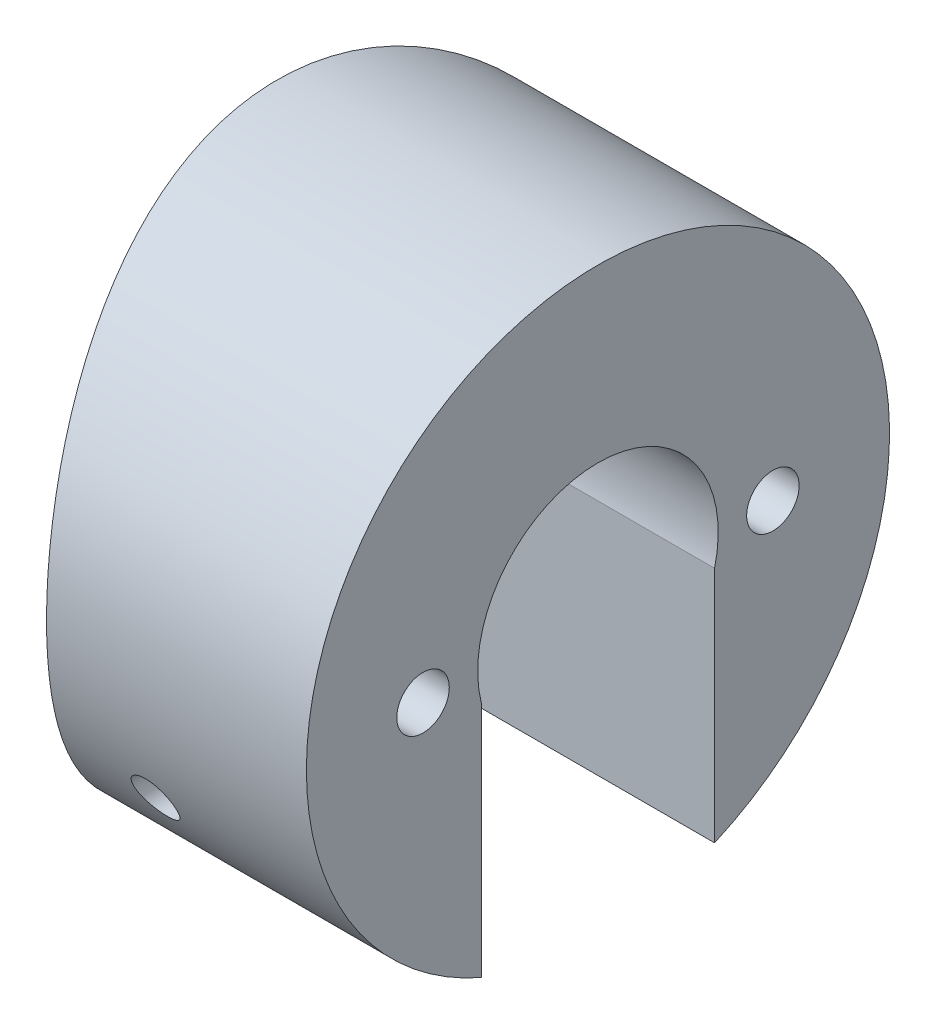
ISO-10303-21;
HEADER;
FILE_DESCRIPTION(('STEP AP214'),'2;1');
FILE_NAME('part.step','',(''),(''),'','','');
FILE_SCHEMA(('AUTOMOTIVE_DESIGN { 1 0 10303 214 1 1 1 1 }'));
ENDSEC;
DATA;
#1=APPLICATION_CONTEXT('core data for automotive mechanical design processes');
#2=APPLICATION_PROTOCOL_DEFINITION('international standard','automotive_design',2000,#1);
#3=PRODUCT_CONTEXT('',#1,'mechanical');
#4=PRODUCT('Part','Part','',(#3));
#5=PRODUCT_RELATED_PRODUCT_CATEGORY('part','',(#4));
#6=PRODUCT_DEFINITION_FORMATION('','',#4);
#7=PRODUCT_DEFINITION_CONTEXT('part definition',#1,'design');
#8=PRODUCT_DEFINITION('design','',#6,#7);
#9=PRODUCT_DEFINITION_SHAPE('','',#8);
#10=(LENGTH_UNIT() NAMED_UNIT(*) SI_UNIT(.MILLI.,.METRE.));
#11=(NAMED_UNIT(*) PLANE_ANGLE_UNIT() SI_UNIT($,.RADIAN.));
#12=(NAMED_UNIT(*) SI_UNIT($,.STERADIAN.) SOLID_ANGLE_UNIT());
#13=UNCERTAINTY_MEASURE_WITH_UNIT(LENGTH_MEASURE(1.E-05),#10,'distance_accuracy_value','');
#14=(GEOMETRIC_REPRESENTATION_CONTEXT(3) GLOBAL_UNCERTAINTY_ASSIGNED_CONTEXT((#13)) GLOBAL_UNIT_ASSIGNED_CONTEXT((#10,
#11,#12)) REPRESENTATION_CONTEXT('',''));
#15=CARTESIAN_POINT('',(0.,0.,0.));
#16=DIRECTION('',(0.,0.,1.));
#17=DIRECTION('',(1.,0.,0.));
#18=AXIS2_PLACEMENT_3D('',#15,#16,#17);
#19=CARTESIAN_POINT('',(22.,0.,0.));
#20=DIRECTION('',(-1.,0.,0.));
#21=DIRECTION('',(0.,0.,1.));
#22=AXIS2_PLACEMENT_3D('',#19,#20,#21);
#23=CYLINDRICAL_SURFACE('',#22,20.);
#24=CARTESIAN_POINT('',(22.,0.,0.));
#25=DIRECTION('',(1.,0.,0.));
#26=DIRECTION('',(0.,0.,-1.));
#27=AXIS2_PLACEMENT_3D('',#24,#25,#26);
#28=CIRCLE('',#27,20.);
#29=CARTESIAN_POINT('',(22.,-18.3303027798234,-8.));
#30=VERTEX_POINT('',#29);
#31=CARTESIAN_POINT('',(22.,-18.3303027798234,8.));
#32=VERTEX_POINT('',#31);
#33=EDGE_CURVE('E11',#30,#32,#28,.T.);
#34=ORIENTED_EDGE('',*,*,#33,.F.);
#35=DIRECTION('',(1.,0.,0.));
#36=VECTOR('',#35,1.);
#37=CARTESIAN_POINT('',(3.,-18.3303027798234,-8.));
#38=LINE('',#37,#36);
#39=CARTESIAN_POINT('',(3.,-18.3303027798234,-8.));
#40=VERTEX_POINT('',#39);
#41=EDGE_CURVE('E134',#40,#30,#38,.T.);
#42=ORIENTED_EDGE('',*,*,#41,.F.);
#43=CARTESIAN_POINT('',(3.,0.,0.));
#44=DIRECTION('',(1.,0.,0.));
#45=DIRECTION('',(0.,0.,-1.));
#46=AXIS2_PLACEMENT_3D('',#43,#44,#45);
#47=CIRCLE('',#46,20.);
#48=CARTESIAN_POINT('',(3.,-18.3303027798234,8.));
#49=VERTEX_POINT('',#48);
#50=EDGE_CURVE('E122',#49,#40,#47,.T.);
#51=ORIENTED_EDGE('',*,*,#50,.F.);
#52=DIRECTION('',(1.,0.,0.));
#53=VECTOR('',#52,1.);
#54=CARTESIAN_POINT('',(3.,-18.3303027798234,8.));
#55=LINE('',#54,#53);
#56=EDGE_CURVE('E136',#49,#32,#55,.T.);
#57=ORIENTED_EDGE('',*,*,#56,.T.);
#58=EDGE_LOOP('',(#34,#42,#51,#57));
#59=FACE_BOUND('',#58,.T.);
#60=CARTESIAN_POINT('',(4.1742430504416,0.,20.));
#61=CARTESIAN_POINT('',(4.17424574491991,0.536358870073699,20.000002745086));
#62=CARTESIAN_POINT('',(4.16480074871791,1.0726807787122,19.9784057100183));
#63=CARTESIAN_POINT('',(4.12734628815721,2.1413968490551,19.8922564992821));
#64=CARTESIAN_POINT('',(4.09933075895137,2.67378967012695,19.8276902905225));
#65=CARTESIAN_POINT('',(4.02562578666756,3.7311779674192,19.6561847747043));
#66=CARTESIAN_POINT('',(3.97991268626716,4.25616256290606,19.5491887446828));
#67=CARTESIAN_POINT('',(3.87232318583603,5.29425280812158,19.2939517854075));
#68=CARTESIAN_POINT('',(3.81044792736054,5.80735929403196,19.1457137690833));
#69=CARTESIAN_POINT('',(3.67271524489487,6.81662973753462,18.8099828265808));
#70=CARTESIAN_POINT('',(3.59690620635507,7.31284549035112,18.6226254464));
#71=CARTESIAN_POINT('',(3.43341536824046,8.28718997491142,18.2099537937689));
#72=CARTESIAN_POINT('',(3.34573338582272,8.76531842796634,17.9846389367617));
#73=CARTESIAN_POINT('',(3.16097678623796,9.70073807689003,17.4978180971837));
#74=CARTESIAN_POINT('',(3.06390406579493,10.158033453253,17.2363194183819));
#75=CARTESIAN_POINT('',(2.86289607552393,11.0496757982505,16.6787667285823));
#76=CARTESIAN_POINT('',(2.75895832028021,11.4840143520137,16.3827001725249));
#77=CARTESIAN_POINT('',(2.54140811072217,12.3491777099323,15.7417404955997));
#78=CARTESIAN_POINT('',(2.42757317773975,12.7786649685178,15.3951163007581));
#79=CARTESIAN_POINT('',(2.1983197051003,13.6073220017524,14.6678125586567));
#80=CARTESIAN_POINT('',(2.08290110924596,14.0064906972255,14.2871318002176));
#81=CARTESIAN_POINT('',(1.85344715837739,14.7724110226879,13.4937036056056));
#82=CARTESIAN_POINT('',(1.73941245413275,15.1391478753347,13.0809417111867));
#83=CARTESIAN_POINT('',(1.51575942659038,15.8376461457061,12.2259394125796));
#84=CARTESIAN_POINT('',(1.4061395893984,16.16941961685,11.7837092537896));
#85=CARTESIAN_POINT('',(1.18987658240766,16.8083942177059,10.8539645476525));
#86=CARTESIAN_POINT('',(1.08352488566488,17.1140946166112,10.3653487453812));
#87=CARTESIAN_POINT('',(0.881589174967274,17.6830153373198,9.3618187870742));
#88=CARTESIAN_POINT('',(0.786005526606734,17.9462342169315,8.8469037389946));
#89=CARTESIAN_POINT('',(0.60838173425428,18.4277518638689,7.7944044036001));
#90=CARTESIAN_POINT('',(0.526337438036368,18.6460644080758,7.25682713003124));
#91=CARTESIAN_POINT('',(0.378181738090144,19.0356860781841,6.16277347128576));
#92=CARTESIAN_POINT('',(0.312069316544084,19.2069982068333,5.60629829600615));
#93=CARTESIAN_POINT('',(0.200543846934672,19.4936501601181,4.50610049401075));
#94=CARTESIAN_POINT('',(0.154283664904529,19.6112981667048,3.96306467078727));
#95=CARTESIAN_POINT('',(0.0792995497702527,19.8011100086609,2.86790025525006));
#96=CARTESIAN_POINT('',(0.0505750991706941,19.8732751862721,2.31577193175817));
#97=CARTESIAN_POINT('',(0.0114919203174706,19.9713034706827,1.2069474276913));
#98=CARTESIAN_POINT('',(0.00112737718253094,19.9971812374832,0.650252749493141));
#99=CARTESIAN_POINT('',(-0.000952769578692542,20.0023822414961,-0.463379816238232));
#100=CARTESIAN_POINT('',(0.00733097120022211,19.9817071153114,-1.02031769453335));
#101=CARTESIAN_POINT('',(0.04131745016855,19.8965161756394,-2.0987015940398));
#102=CARTESIAN_POINT('',(0.0660140867334181,19.8345320012178,-2.62038173826592));
#103=CARTESIAN_POINT('',(0.131162084082088,19.6699442550121,-3.65626989476221));
#104=CARTESIAN_POINT('',(0.171612741752613,19.5673424960165,-4.17047823944189));
#105=CARTESIAN_POINT('',(0.267253075917779,19.322494731678,-5.18797037252757));
#106=CARTESIAN_POINT('',(0.322443286566317,19.1802472895876,-5.691253764304));
#107=CARTESIAN_POINT('',(0.446203699907521,18.8573843519032,-6.68366357309595));
#108=CARTESIAN_POINT('',(0.514774280196276,18.6767677735134,-7.17278959014076));
#109=CARTESIAN_POINT('',(0.664768502039076,18.2756715526388,-8.14116774685088));
#110=CARTESIAN_POINT('',(0.746369960546063,18.0546331689949,-8.62016070201116));
#111=CARTESIAN_POINT('',(0.919691931096619,17.5762997951821,-9.55775491289232));
#112=CARTESIAN_POINT('',(1.01141247527849,17.3190046898608,-10.0163561038423));
#113=CARTESIAN_POINT('',(1.20281490948725,16.7699572445169,-10.9107238225224));
#114=CARTESIAN_POINT('',(1.30249729857665,16.4782027439688,-11.3464889160058));
#115=CARTESIAN_POINT('',(1.50754096797949,15.8619991995661,-12.1930807128327));
#116=CARTESIAN_POINT('',(1.61290443588988,15.5375375188238,-12.6038976781172));
#117=CARTESIAN_POINT('',(1.83384582313197,14.8356493224441,-13.4243694083953));
#118=CARTESIAN_POINT('',(1.94964115031902,14.4561467967005,-13.8321916381475));
#119=CARTESIAN_POINT('',(2.18183355978225,13.6645598310379,-14.6147037769592));
#120=CARTESIAN_POINT('',(2.29823065836837,13.2524745036473,-14.9893927829658));
#121=CARTESIAN_POINT('',(2.52856497943841,12.3978437901968,-15.7036222448741));
#122=CARTESIAN_POINT('',(2.64250084189658,11.9552821019754,-16.0431436422219));
#123=CARTESIAN_POINT('',(2.86469918558485,11.0423100902187,-16.6846847820429));
#124=CARTESIAN_POINT('',(2.97296084724299,10.5718957644789,-16.9866991156397));
#125=CARTESIAN_POINT('',(3.18367834271226,9.59184775225848,-17.559266081043));
#126=CARTESIAN_POINT('',(3.28587284530432,9.08147044676044,-17.8286445751127));
#127=CARTESIAN_POINT('',(3.47753521907668,8.037585480209,-18.3229518522866));
#128=CARTESIAN_POINT('',(3.56700863704786,7.50408803348436,-18.5479000251566));
#129=CARTESIAN_POINT('',(3.73006024207314,6.41831978658129,-18.9509874453093));
#130=CARTESIAN_POINT('',(3.80366424652587,5.86608119626896,-19.1292028242891));
#131=CARTESIAN_POINT('',(3.93244599231106,4.74642811422398,-19.4372935971338));
#132=CARTESIAN_POINT('',(3.98763205825025,4.17902060419237,-19.5671908330578));
#133=CARTESIAN_POINT('',(4.07910865942675,3.01295889808927,-19.7809458492822));
#134=CARTESIAN_POINT('',(4.11465383599612,2.413912535015,-19.8629933682657));
#135=CARTESIAN_POINT('',(4.16221940966298,1.20989507510511,-19.9725186581405));
#136=CARTESIAN_POINT('',(4.17424001151603,0.604924029883411,-19.9999969039973));
#137=CARTESIAN_POINT('',(4.17424574491991,-0.536358870073701,-20.000002745086));
#138=CARTESIAN_POINT('',(4.16480074871792,-1.0726807787122,-19.9784057100183));
#139=CARTESIAN_POINT('',(4.12734628815722,-2.14139684905511,-19.8922564992821));
#140=CARTESIAN_POINT('',(4.09933075895137,-2.67378967012695,-19.8276902905225));
#141=CARTESIAN_POINT('',(4.02562578666756,-3.7311779674192,-19.6561847747043));
#142=CARTESIAN_POINT('',(3.97991268626716,-4.25616256290607,-19.5491887446828));
#143=CARTESIAN_POINT('',(3.87232318583603,-5.29425280812158,-19.2939517854075));
#144=CARTESIAN_POINT('',(3.81044792736055,-5.80735929403197,-19.1457137690833));
#145=CARTESIAN_POINT('',(3.67271524489487,-6.81662973753462,-18.8099828265808));
#146=CARTESIAN_POINT('',(3.59690620635506,-7.31284549035112,-18.6226254464));
#147=CARTESIAN_POINT('',(3.43341536824045,-8.28718997491142,-18.2099537937689));
#148=CARTESIAN_POINT('',(3.34573338582272,-8.76531842796633,-17.9846389367617));
#149=CARTESIAN_POINT('',(3.16097678623797,-9.70073807689003,-17.4978180971837));
#150=CARTESIAN_POINT('',(3.06390406579494,-10.158033453253,-17.2363194183819));
#151=CARTESIAN_POINT('',(2.86289607552394,-11.0496757982505,-16.6787667285823));
#152=CARTESIAN_POINT('',(2.75895832028022,-11.4840143520137,-16.3827001725249));
#153=CARTESIAN_POINT('',(2.54140811072217,-12.3491777099323,-15.7417404955997));
#154=CARTESIAN_POINT('',(2.42757317773976,-12.7786649685178,-15.3951163007581));
#155=CARTESIAN_POINT('',(2.19831970510031,-13.6073220017524,-14.6678125586567));
#156=CARTESIAN_POINT('',(2.08290110924596,-14.0064906972255,-14.2871318002176));
#157=CARTESIAN_POINT('',(1.85344715837739,-14.7724110226879,-13.4937036056056));
#158=CARTESIAN_POINT('',(1.73941245413275,-15.1391478753348,-13.0809417111867));
#159=CARTESIAN_POINT('',(1.51575942659038,-15.8376461457061,-12.2259394125796));
#160=CARTESIAN_POINT('',(1.4061395893984,-16.16941961685,-11.7837092537896));
#161=CARTESIAN_POINT('',(1.18987658240766,-16.8083942177059,-10.8539645476525));
#162=CARTESIAN_POINT('',(1.08352488566488,-17.1140946166112,-10.3653487453812));
#163=CARTESIAN_POINT('',(0.881589174967272,-17.6830153373198,-9.36181878707421));
#164=CARTESIAN_POINT('',(0.786005526606733,-17.9462342169316,-8.8469037389946));
#165=CARTESIAN_POINT('',(0.608381734254287,-18.4277518638689,-7.79440440360009));
#166=CARTESIAN_POINT('',(0.526337438036382,-18.6460644080758,-7.25682713003124));
#167=CARTESIAN_POINT('',(0.378181738090151,-19.0356860781841,-6.16277347128576));
#168=CARTESIAN_POINT('',(0.312069316544078,-19.2069982068333,-5.60629829600615));
#169=CARTESIAN_POINT('',(0.200543846934661,-19.4936501601181,-4.50610049401075));
#170=CARTESIAN_POINT('',(0.154283664904527,-19.6112981667048,-3.96306467078728));
#171=CARTESIAN_POINT('',(0.0792995497702536,-19.8011100086609,-2.86790025525006));
#172=CARTESIAN_POINT('',(0.0505750991706906,-19.8732751862721,-2.31577193175818));
#173=CARTESIAN_POINT('',(0.0114919203174643,-19.9713034706827,-1.20694742769131));
#174=CARTESIAN_POINT('',(0.00112737718252646,-19.9971812374832,-0.650252749493152));
#175=CARTESIAN_POINT('',(-0.000952769578695353,-20.0023822414961,0.463379816238224));
#176=CARTESIAN_POINT('',(0.00733097120021923,-19.9817071153114,1.02031769453335));
#177=CARTESIAN_POINT('',(0.0413174501685493,-19.8965161756394,2.0987015940398));
#178=CARTESIAN_POINT('',(0.0660140867334194,-19.8345320012178,2.62038173826592));
#179=CARTESIAN_POINT('',(0.131162084082091,-19.6699442550121,3.6562698947622));
#180=CARTESIAN_POINT('',(0.171612741752614,-19.5673424960165,4.17047823944188));
#181=CARTESIAN_POINT('',(0.267253075917781,-19.322494731678,5.18797037252757));
#182=CARTESIAN_POINT('',(0.32244328656632,-19.1802472895876,5.69125376430399));
#183=CARTESIAN_POINT('',(0.446203699907519,-18.8573843519032,6.68366357309595));
#184=CARTESIAN_POINT('',(0.514774280196267,-18.6767677735134,7.17278959014076));
#185=CARTESIAN_POINT('',(0.664768502039066,-18.2756715526388,8.14116774685088));
#186=CARTESIAN_POINT('',(0.746369960546058,-18.0546331689949,8.62016070201116));
#187=CARTESIAN_POINT('',(0.919691931096623,-17.5762997951821,9.55775491289232));
#188=CARTESIAN_POINT('',(1.01141247527849,-17.3190046898608,10.0163561038423));
#189=CARTESIAN_POINT('',(1.20281490948725,-16.7699572445169,10.9107238225224));
#190=CARTESIAN_POINT('',(1.30249729857666,-16.4782027439688,11.3464889160058));
#191=CARTESIAN_POINT('',(1.50754096797949,-15.8619991995661,12.1930807128327));
#192=CARTESIAN_POINT('',(1.61290443588988,-15.5375375188238,12.6038976781172));
#193=CARTESIAN_POINT('',(1.83384582313196,-14.8356493224441,13.4243694083953));
#194=CARTESIAN_POINT('',(1.94964115031901,-14.4561467967005,13.8321916381475));
#195=CARTESIAN_POINT('',(2.18183355978225,-13.6645598310379,14.6147037769592));
#196=CARTESIAN_POINT('',(2.29823065836837,-13.2524745036473,14.9893927829658));
#197=CARTESIAN_POINT('',(2.52856497943842,-12.3978437901968,15.7036222448741));
#198=CARTESIAN_POINT('',(2.64250084189659,-11.9552821019754,16.0431436422219));
#199=CARTESIAN_POINT('',(2.86469918558486,-11.0423100902187,16.6846847820429));
#200=CARTESIAN_POINT('',(2.97296084724299,-10.5718957644789,16.9866991156397));
#201=CARTESIAN_POINT('',(3.18367834271225,-9.59184775225848,17.559266081043));
#202=CARTESIAN_POINT('',(3.28587284530432,-9.08147044676044,17.8286445751128));
#203=CARTESIAN_POINT('',(3.47753521907668,-8.037585480209,18.3229518522866));
#204=CARTESIAN_POINT('',(3.56700863704786,-7.50408803348436,18.5479000251566));
#205=CARTESIAN_POINT('',(3.73006024207314,-6.41831978658129,18.9509874453093));
#206=CARTESIAN_POINT('',(3.80366424652586,-5.86608119626896,19.1292028242891));
#207=CARTESIAN_POINT('',(3.93244599231105,-4.74642811422398,19.4372935971338));
#208=CARTESIAN_POINT('',(3.98763205825025,-4.17902060419236,19.5671908330578));
#209=CARTESIAN_POINT('',(4.07910865942675,-3.01295889808927,19.7809458492822));
#210=CARTESIAN_POINT('',(4.11465383599611,-2.41391253501499,19.8629933682657));
#211=CARTESIAN_POINT('',(4.16221940966298,-1.20989507510511,19.9725186581405));
#212=CARTESIAN_POINT('',(4.17424001151604,-0.60492402988341,19.9999969039973));
#213=CARTESIAN_POINT('',(4.1742430504416,0.,20.));
#214=B_SPLINE_CURVE_WITH_KNOTS('',3,(#60,#61,#62,#63,#64,#65,#66,#67,#68,#69,#70,#71,#72,#73,
#74,#75,#76,#77,#78,#79,#80,#81,#82,#83,#84,#85,#86,#87,#88,#89,#90,#91,#92,#93,#94,#95,#96,#97,
#98,#99,#100,#101,#102,#103,#104,#105,#106,#107,#108,#109,#110,#111,#112,#113,#114,#115,#116,
#117,#118,#119,#120,#121,#122,#123,#124,#125,#126,#127,#128,#129,#130,#131,#132,#133,#134,#135,
#136,#137,#138,#139,#140,#141,#142,#143,#144,#145,#146,#147,#148,#149,#150,#151,#152,#153,#154,
#155,#156,#157,#158,#159,#160,#161,#162,#163,#164,#165,#166,#167,#168,#169,#170,#171,#172,#173,
#174,#175,#176,#177,#178,#179,#180,#181,#182,#183,#184,#185,#186,#187,#188,#189,#190,#191,#192,
#193,#194,#195,#196,#197,#198,#199,#200,#201,#202,#203,#204,#205,#206,#207,#208,#209,#210,#211,
#212,#213),.UNSPECIFIED.,.T.,.F.,(4,2,2,2,2,2,2,2,2,2,2,2,2,2,2,2,2,2,2,2,2,2,2,2,2,2,2,2,2,2,2,
2,2,2,2,2,2,2,2,2,2,2,2,2,2,2,2,2,2,2,2,2,2,2,2,2,2,2,2,2,2,2,2,2,2,2,2,2,2,2,2,2,2,2,2,2,4),
(0.,1.60849859234167,3.21752275428069,4.82870525613023,6.43977398872174,8.04535045620413,
9.65095165232053,11.256229226468,12.8620911948077,14.5508084522194,16.2395857906476,
17.9291286861089,19.6180872029707,21.3741737788173,23.1303199589506,24.8859265621776,
26.6414209776306,28.3119302369361,29.9823901956066,31.6523209977858,33.3221930931767,
34.8981282635126,36.4739931067885,38.0499150663552,39.6258815051153,41.2255530622854,
42.8252297001717,44.4250066874266,46.0254041578933,47.7304500555621,49.4355424103015,
51.1415540318955,52.8478113916636,54.6038200880267,56.3590607459224,58.1114239490546,
59.86299403665,61.6771300079311,63.4912501890841,65.0997487814258,66.7087729433648,
68.3199554452143,69.9310241778059,71.5366006452882,73.1422018414046,74.747479415552,
76.3533413838918,78.0420586413035,79.7308359797317,81.420378875193,83.1093373920548,
84.8654239679014,86.6215701480347,88.3771767512617,90.1326711667147,91.8031804260201,
93.4736403846907,95.1435711868699,96.8134432822608,98.3893784525967,99.9652432958726,
101.541165255439,103.117131694199,104.716803251369,106.316479889256,107.916256876511,
109.516654346977,111.221700244646,112.926792599386,114.63280422098,116.339061580748,
118.095070277111,119.850310935007,121.602674138139,123.354244225734,125.168380197015,
126.982500378168),.UNSPECIFIED.);
#215=CARTESIAN_POINT('',(4.1742430504416,0.,20.));
#216=VERTEX_POINT('',#215);
#217=EDGE_CURVE('E214',#216,#216,#214,.T.);
#218=ORIENTED_EDGE('',*,*,#217,.F.);
#219=EDGE_LOOP('',(#218));
#220=FACE_BOUND('',#219,.T.);
#221=CARTESIAN_POINT('',(8.,-9.,17.8605710994918));
#222=CARTESIAN_POINT('',(8.00000186736244,-8.91015367651355,17.9058442748124));
#223=CARTESIAN_POINT('',(8.00808042025597,-8.81993190025972,17.950450048481));
#224=CARTESIAN_POINT('',(8.04071070550431,-8.64121173468298,18.037165362465));
#225=CARTESIAN_POINT('',(8.06526931777487,-8.55271408101232,18.0792738522476));
#226=CARTESIAN_POINT('',(8.13102062788308,-8.37994810516734,18.1599997523331));
#227=CARTESIAN_POINT('',(8.17227111767223,-8.29569563249405,18.1986044571187));
#228=CARTESIAN_POINT('',(8.2709536907754,-8.13494123819163,18.2710291032132));
#229=CARTESIAN_POINT('',(8.32837791139831,-8.0584355750399,18.3048513574901));
#230=CARTESIAN_POINT('',(8.45329310190416,-7.92189403751846,18.3643332026838));
#231=CARTESIAN_POINT('',(8.51969900031738,-7.86105140061585,18.390415903592));
#232=CARTESIAN_POINT('',(8.66363433405502,-7.7515394925722,18.4368430986259));
#233=CARTESIAN_POINT('',(8.74115695076546,-7.70286280908845,18.4571910877053));
#234=CARTESIAN_POINT('',(8.89749165021182,-7.62378920191763,18.4899840752858));
#235=CARTESIAN_POINT('',(8.9755566690478,-7.59213946257974,18.5029763789523));
#236=CARTESIAN_POINT('',(9.13655204280465,-7.54226303117205,18.5233637207404));
#237=CARTESIAN_POINT('',(9.2194803560505,-7.52403074921877,18.5307610898187));
#238=CARTESIAN_POINT('',(9.38248518618471,-7.50248751582391,18.53949315198));
#239=CARTESIAN_POINT('',(9.46243543310533,-7.49834901328044,18.5411641246779));
#240=CARTESIAN_POINT('',(9.62191048674785,-7.50283692665312,18.5393485526947));
#241=CARTESIAN_POINT('',(9.70143536215699,-7.51146121515312,18.5358628675714));
#242=CARTESIAN_POINT('',(9.85626744160028,-7.5408329494124,18.5239326079801));
#243=CARTESIAN_POINT('',(9.93162565561219,-7.56135118963444,18.5155817737425));
#244=CARTESIAN_POINT('',(10.0776648426645,-7.61352355823914,18.494189590032));
#245=CARTESIAN_POINT('',(10.1483456145494,-7.64517816517703,18.4811480389879));
#246=CARTESIAN_POINT('',(10.2847160534802,-7.71923140405273,18.450341492105));
#247=CARTESIAN_POINT('',(10.3502681204784,-7.76184360820129,18.4324822092192));
#248=CARTESIAN_POINT('',(10.4732035130853,-7.85594078373199,18.3925746229299));
#249=CARTESIAN_POINT('',(10.5305851913489,-7.9074275398226,18.3705254768364));
#250=CARTESIAN_POINT('',(10.6390678609954,-8.02070764599631,18.3213608170003));
#251=CARTESIAN_POINT('',(10.6896362456629,-8.08291703807592,18.2940305410212));
#252=CARTESIAN_POINT('',(10.7796673293928,-8.21339876044613,18.2358215172264));
#253=CARTESIAN_POINT('',(10.8191264454073,-8.28167303751204,18.204941629074));
#254=CARTESIAN_POINT('',(10.889276783848,-8.42813621214869,18.1376272518999));
#255=CARTESIAN_POINT('',(10.9189895804365,-8.50667951621718,18.1009451154285));
#256=CARTESIAN_POINT('',(10.9648032300346,-8.6664353453203,18.0250029823114));
#257=CARTESIAN_POINT('',(10.9808987561306,-8.74764890203191,17.9857419833114));
#258=CARTESIAN_POINT('',(11.0004195546185,-8.91799568264731,17.9019308841943));
#259=CARTESIAN_POINT('',(11.0025972037238,-9.00719361168679,17.8572202264461));
#260=CARTESIAN_POINT('',(10.9912960011289,-9.18412675657615,17.7668708253994));
#261=CARTESIAN_POINT('',(10.9778111185117,-9.27186139578218,17.721231731253));
#262=CARTESIAN_POINT('',(10.934283666409,-9.44906414369367,17.6274172066018));
#263=CARTESIAN_POINT('',(10.9032706467011,-9.53830510363157,17.5792590638266));
#264=CARTESIAN_POINT('',(10.8245509782745,-9.71028978027571,17.4848478691187));
#265=CARTESIAN_POINT('',(10.7768367127707,-9.79303051136449,17.4385956972006));
#266=CARTESIAN_POINT('',(10.6659331320213,-9.94848504341206,17.350376181559));
#267=CARTESIAN_POINT('',(10.6029102364992,-10.021294335778,17.3083692140255));
#268=CARTESIAN_POINT('',(10.4621277316663,-10.1548532448928,17.2303491874207));
#269=CARTESIAN_POINT('',(10.3843928190027,-10.2156227275394,17.1943262707001));
#270=CARTESIAN_POINT('',(10.2370052818273,-10.3085949244461,17.1387003186075));
#271=CARTESIAN_POINT('',(10.1701504857031,-10.3441435065226,17.1172417300545));
#272=CARTESIAN_POINT('',(10.0304526537022,-10.4051386032878,17.0802332048379));
#273=CARTESIAN_POINT('',(9.95761391619453,-10.4305922940331,17.0646790712703));
#274=CARTESIAN_POINT('',(9.80745429046643,-10.4702128940576,17.0403988877188));
#275=CARTESIAN_POINT('',(9.73011501950241,-10.4843294345523,17.0317033120168));
#276=CARTESIAN_POINT('',(9.57370181422493,-10.500246805875,17.0218950295168));
#277=CARTESIAN_POINT('',(9.49462834641962,-10.5020509090179,17.0207803079319));
#278=CARTESIAN_POINT('',(9.34358499709447,-10.4935894736447,17.0259976080138));
#279=CARTESIAN_POINT('',(9.27154051560404,-10.4842507616643,17.0317578048367));
#280=CARTESIAN_POINT('',(9.13028535862499,-10.4555090440633,17.0494167537694));
#281=CARTESIAN_POINT('',(9.06107473223479,-10.4361058641486,17.0613156121871));
#282=CARTESIAN_POINT('',(8.92621600533366,-10.387795877189,17.0907724093663));
#283=CARTESIAN_POINT('',(8.86063198022279,-10.3587587901093,17.1084078566445));
#284=CARTESIAN_POINT('',(8.73536647116244,-10.2924257856617,17.1483954912821));
#285=CARTESIAN_POINT('',(8.67568684785335,-10.255127276808,17.1707491585736));
#286=CARTESIAN_POINT('',(8.55712067752593,-10.1691427330998,17.2218258892827));
#287=CARTESIAN_POINT('',(8.49899029600891,-10.1196683088162,17.250973129143));
#288=CARTESIAN_POINT('',(8.39173862961168,-10.0136332506944,17.3127385974266));
#289=CARTESIAN_POINT('',(8.34262293871329,-9.95706825325699,17.3453589613621));
#290=CARTESIAN_POINT('',(8.24765305372977,-9.829922925566,17.4177690436407));
#291=CARTESIAN_POINT('',(8.20321835319464,-9.75848914586708,17.4579230874725));
#292=CARTESIAN_POINT('',(8.12714418101039,-9.61009983617849,17.5400448656084));
#293=CARTESIAN_POINT('',(8.09550554131163,-9.53314394754554,17.582012717643));
#294=CARTESIAN_POINT('',(8.04714389550394,-9.38095752730276,17.6636509065095));
#295=CARTESIAN_POINT('',(8.02953130429416,-9.30598375358801,17.7032762493439));
#296=CARTESIAN_POINT('',(8.00595799013279,-9.15409914858956,17.7822889743576));
#297=CARTESIAN_POINT('',(7.99999839572494,-9.0771881304224,17.8216763331209));
#298=CARTESIAN_POINT('',(8.,-9.,17.8605710994918));
#299=B_SPLINE_CURVE_WITH_KNOTS('',3,(#221,#222,#223,#224,#225,#226,#227,#228,#229,#230,#231,
#232,#233,#234,#235,#236,#237,#238,#239,#240,#241,#242,#243,#244,#245,#246,#247,#248,#249,#250,
#251,#252,#253,#254,#255,#256,#257,#258,#259,#260,#261,#262,#263,#264,#265,#266,#267,#268,#269,
#270,#271,#272,#273,#274,#275,#276,#277,#278,#279,#280,#281,#282,#283,#284,#285,#286,#287,#288,
#289,#290,#291,#292,#293,#294,#295,#296,#297,#298),.UNSPECIFIED.,.T.,.F.,(4,2,2,2,2,2,2,2,2,2,2,
2,2,2,2,2,2,2,2,2,2,2,2,2,2,2,2,2,2,2,2,2,2,2,2,2,2,2,4),(0.,0.301539464373684,
0.603204890538183,0.905923827547209,1.20849585414866,1.48826085466791,1.76785498513333,
2.02222923165376,2.27649744253904,2.5155513353352,2.75456538497871,2.98911973046031,
3.22368415651152,3.46322199026306,3.70280805237029,3.95582863775337,4.20893073606689,
4.4826897073176,4.75655572035916,5.05466313986715,5.352885384828,5.66951147462454,
5.98628215374574,6.29975229276808,6.61270081220398,6.84782049067785,7.08277273105848,
7.31876313250055,7.55469081159537,7.77228876568654,7.98989048821258,8.21056370997649,
8.4313062519477,8.6754727605798,8.91979027593269,9.19831535158318,9.47685853294617,
9.73588987467014,9.99494630124823),.UNSPECIFIED.);
#300=CARTESIAN_POINT('',(8.,-9.,17.8605710994918));
#301=VERTEX_POINT('',#300);
#302=EDGE_CURVE('E102',#301,#301,#299,.T.);
#303=ORIENTED_EDGE('',*,*,#302,.T.);
#304=EDGE_LOOP('',(#303));
#305=FACE_BOUND('',#304,.T.);
#306=ADVANCED_FACE('F38',(#59,#220,#305),#23,.T.);
#307=CARTESIAN_POINT('',(22.,0.,0.));
#308=DIRECTION('',(1.,0.,0.));
#309=DIRECTION('',(0.,0.,-1.));
#310=AXIS2_PLACEMENT_3D('',#307,#308,#309);
#311=PLANE('',#310);
#312=CARTESIAN_POINT('',(22.,0.,-12.));
#313=DIRECTION('',(1.,0.,0.));
#314=DIRECTION('',(0.,0.,-1.));
#315=AXIS2_PLACEMENT_3D('',#312,#313,#314);
#316=CIRCLE('',#315,1.8);
#317=CARTESIAN_POINT('',(22.,0.,-13.8));
#318=VERTEX_POINT('',#317);
#319=EDGE_CURVE('E106',#318,#318,#316,.T.);
#320=ORIENTED_EDGE('',*,*,#319,.F.);
#321=EDGE_LOOP('',(#320));
#322=FACE_BOUND('',#321,.T.);
#323=CARTESIAN_POINT('',(22.,0.,12.));
#324=DIRECTION('',(1.,0.,0.));
#325=DIRECTION('',(0.,0.,-1.));
#326=AXIS2_PLACEMENT_3D('',#323,#324,#325);
#327=CIRCLE('',#326,1.8);
#328=CARTESIAN_POINT('',(22.,0.,10.2));
#329=VERTEX_POINT('',#328);
#330=EDGE_CURVE('E105',#329,#329,#327,.T.);
#331=ORIENTED_EDGE('',*,*,#330,.F.);
#332=EDGE_LOOP('',(#331));
#333=FACE_BOUND('',#332,.T.);
#334=DIRECTION('',(0.,1.,0.));
#335=VECTOR('',#334,1.);
#336=CARTESIAN_POINT('',(22.,-2.01556443707464,-8.));
#337=LINE('',#336,#335);
#338=CARTESIAN_POINT('',(22.,-2.01556443707464,-8.));
#339=VERTEX_POINT('',#338);
#340=EDGE_CURVE('E119',#30,#339,#337,.T.);
#341=ORIENTED_EDGE('',*,*,#340,.F.);
#342=ORIENTED_EDGE('',*,*,#33,.T.);
#343=DIRECTION('',(0.,-1.,0.));
#344=VECTOR('',#343,1.);
#345=CARTESIAN_POINT('',(22.,-18.3303027798234,8.));
#346=LINE('',#345,#344);
#347=CARTESIAN_POINT('',(22.,-2.01556443707464,8.));
#348=VERTEX_POINT('',#347);
#349=EDGE_CURVE('E129',#348,#32,#346,.T.);
#350=ORIENTED_EDGE('',*,*,#349,.F.);
#351=CARTESIAN_POINT('',(22.,0.,0.));
#352=DIRECTION('',(1.,0.,0.));
#353=DIRECTION('',(0.,0.,-1.));
#354=AXIS2_PLACEMENT_3D('',#351,#352,#353);
#355=CIRCLE('',#354,8.25);
#356=EDGE_CURVE('E59',#339,#348,#355,.T.);
#357=ORIENTED_EDGE('',*,*,#356,.F.);
#358=EDGE_LOOP('',(#341,#342,#350,#357));
#359=FACE_BOUND('',#358,.T.);
#360=ADVANCED_FACE('F145',(#322,#333,#359),#311,.T.);
#361=CARTESIAN_POINT('',(3.,0.,0.));
#362=DIRECTION('',(1.,0.,0.));
#363=DIRECTION('',(0.,0.,-1.));
#364=AXIS2_PLACEMENT_3D('',#361,#362,#363);
#365=CYLINDRICAL_SURFACE('',#364,8.25);
#366=ORIENTED_EDGE('',*,*,#356,.T.);
#367=DIRECTION('',(1.,0.,0.));
#368=VECTOR('',#367,1.);
#369=CARTESIAN_POINT('',(3.,-2.01556443707464,8.));
#370=LINE('',#369,#368);
#371=CARTESIAN_POINT('',(3.,-2.01556443707464,8.));
#372=VERTEX_POINT('',#371);
#373=EDGE_CURVE('E127',#372,#348,#370,.T.);
#374=ORIENTED_EDGE('',*,*,#373,.F.);
#375=CARTESIAN_POINT('',(3.,0.,0.));
#376=DIRECTION('',(1.,0.,0.));
#377=DIRECTION('',(0.,0.,-1.));
#378=AXIS2_PLACEMENT_3D('',#375,#376,#377);
#379=CIRCLE('',#378,8.25);
#380=CARTESIAN_POINT('',(3.,-2.01556443707464,-8.));
#381=VERTEX_POINT('',#380);
#382=EDGE_CURVE('E115',#381,#372,#379,.T.);
#383=ORIENTED_EDGE('',*,*,#382,.F.);
#384=DIRECTION('',(1.,0.,0.));
#385=VECTOR('',#384,1.);
#386=CARTESIAN_POINT('',(3.,-2.01556443707464,-8.));
#387=LINE('',#386,#385);
#388=EDGE_CURVE('E45',#381,#339,#387,.T.);
#389=ORIENTED_EDGE('',*,*,#388,.T.);
#390=EDGE_LOOP('',(#366,#374,#383,#389));
#391=FACE_BOUND('',#390,.T.);
#392=ADVANCED_FACE('F154',(#391),#365,.F.);
#393=CARTESIAN_POINT('',(3.,-2.01556443707464,-8.));
#394=DIRECTION('',(0.,0.,-1.));
#395=DIRECTION('',(0.,1.,0.));
#396=AXIS2_PLACEMENT_3D('',#393,#394,#395);
#397=PLANE('',#396);
#398=ORIENTED_EDGE('',*,*,#340,.T.);
#399=ORIENTED_EDGE('',*,*,#388,.F.);
#400=DIRECTION('',(0.,1.,0.));
#401=VECTOR('',#400,1.);
#402=CARTESIAN_POINT('',(3.,-2.01556443707464,-8.));
#403=LINE('',#402,#401);
#404=EDGE_CURVE('E124',#40,#381,#403,.T.);
#405=ORIENTED_EDGE('',*,*,#404,.F.);
#406=ORIENTED_EDGE('',*,*,#41,.T.);
#407=EDGE_LOOP('',(#398,#399,#405,#406));
#408=FACE_BOUND('',#407,.T.);
#409=ADVANCED_FACE('F156',(#408),#397,.F.);
#410=CARTESIAN_POINT('',(3.,-18.3303027798234,8.));
#411=DIRECTION('',(0.,0.,1.));
#412=DIRECTION('',(1.,0.,0.));
#413=AXIS2_PLACEMENT_3D('',#410,#411,#412);
#414=PLANE('',#413);
#415=CARTESIAN_POINT('',(9.5,-9.,8.));
#416=DIRECTION('',(0.,0.,1.));
#417=DIRECTION('',(1.,0.,0.));
#418=AXIS2_PLACEMENT_3D('',#415,#416,#417);
#419=CIRCLE('',#418,1.5);
#420=CARTESIAN_POINT('',(11.,-9.,8.));
#421=VERTEX_POINT('',#420);
#422=EDGE_CURVE('E251',#421,#421,#419,.T.);
#423=ORIENTED_EDGE('',*,*,#422,.T.);
#424=EDGE_LOOP('',(#423));
#425=FACE_BOUND('',#424,.T.);
#426=ORIENTED_EDGE('',*,*,#349,.T.);
#427=ORIENTED_EDGE('',*,*,#56,.F.);
#428=DIRECTION('',(0.,-1.,0.));
#429=VECTOR('',#428,1.);
#430=CARTESIAN_POINT('',(3.,-18.3303027798234,8.));
#431=LINE('',#430,#429);
#432=EDGE_CURVE('E118',#372,#49,#431,.T.);
#433=ORIENTED_EDGE('',*,*,#432,.F.);
#434=ORIENTED_EDGE('',*,*,#373,.T.);
#435=EDGE_LOOP('',(#426,#427,#433,#434));
#436=FACE_BOUND('',#435,.T.);
#437=ADVANCED_FACE('F141',(#425,#436),#414,.F.);
#438=CARTESIAN_POINT('',(3.,0.,0.));
#439=DIRECTION('',(1.,0.,0.));
#440=DIRECTION('',(0.,0.,-1.));
#441=AXIS2_PLACEMENT_3D('',#438,#439,#440);
#442=PLANE('',#441);
#443=ORIENTED_EDGE('',*,*,#382,.T.);
#444=ORIENTED_EDGE('',*,*,#432,.T.);
#445=ORIENTED_EDGE('',*,*,#50,.T.);
#446=ORIENTED_EDGE('',*,*,#404,.T.);
#447=EDGE_LOOP('',(#443,#444,#445,#446));
#448=FACE_BOUND('',#447,.T.);
#449=ADVANCED_FACE('F152',(#448),#442,.T.);
#450=CARTESIAN_POINT('',(0.,0.,12.));
#451=DIRECTION('',(-1.,0.,0.));
#452=DIRECTION('',(0.,0.,1.));
#453=AXIS2_PLACEMENT_3D('',#450,#451,#452);
#454=CYLINDRICAL_SURFACE('',#453,1.8);
#455=CARTESIAN_POINT('',(1.56,-1.75675443624745,12.3921910895532));
#456=CARTESIAN_POINT('',(1.57286841439275,-1.74552299297908,12.4424942853975));
#457=CARTESIAN_POINT('',(1.5856942535586,-1.7321355058427,12.4923010008671));
#458=CARTESIAN_POINT('',(1.61117156238128,-1.70112384200553,12.5906257052138));
#459=CARTESIAN_POINT('',(1.6238230240767,-1.68349947253759,12.6391436353431));
#460=CARTESIAN_POINT('',(1.66137108519483,-1.62440039829635,12.7822788206525));
#461=CARTESIAN_POINT('',(1.68587090786738,-1.57669139725003,12.8745147135185));
#462=CARTESIAN_POINT('',(1.73292404193793,-1.46583356643379,13.0498142288593));
#463=CARTESIAN_POINT('',(1.75547556358686,-1.40267074030451,13.1328694369337));
#464=CARTESIAN_POINT('',(1.79774863318129,-1.26253503203271,13.2871880425601));
#465=CARTESIAN_POINT('',(1.817471638453,-1.18556930784521,13.3584575153526));
#466=CARTESIAN_POINT('',(1.85289835032796,-1.02156717639264,13.4855806131276));
#467=CARTESIAN_POINT('',(1.86867514478091,-0.934765380350304,13.5417163465531));
#468=CARTESIAN_POINT('',(1.89601082292131,-0.75230421313977,13.6385031727658));
#469=CARTESIAN_POINT('',(1.90757066047114,-0.656646851218071,13.6791577674292));
#470=CARTESIAN_POINT('',(1.92508222654482,-0.468325720524283,13.7405679452609));
#471=CARTESIAN_POINT('',(1.93144748143818,-0.376177225389579,13.7627938091871));
#472=CARTESIAN_POINT('',(1.93996511383257,-0.189354136040887,13.7925084678286));
#473=CARTESIAN_POINT('',(1.94211842186697,-0.0946801044724803,13.8000005176453));
#474=CARTESIAN_POINT('',(1.94211803525405,0.0983967759822188,13.7999994620345));
#475=CARTESIAN_POINT('',(1.93979195087612,0.196800111010815,13.7919065687668));
#476=CARTESIAN_POINT('',(1.93059548520344,0.39077511255149,13.7598191186043));
#477=CARTESIAN_POINT('',(1.92372396957162,0.486346066005585,13.7358205923695));
#478=CARTESIAN_POINT('',(1.90575737838708,0.671862683451293,13.6727791933587));
#479=CARTESIAN_POINT('',(1.89466602495146,0.761813223768735,13.6337495784168));
#480=CARTESIAN_POINT('',(1.86874065680836,0.933767919978311,13.5419400449502));
#481=CARTESIAN_POINT('',(1.8539072645785,1.01577339437272,13.489162413322));
#482=CARTESIAN_POINT('',(1.82079268038548,1.17120051736702,13.3704088778235));
#483=CARTESIAN_POINT('',(1.80245469863116,1.24444292309636,13.3042143063178));
#484=CARTESIAN_POINT('',(1.76319875633068,1.37888661951263,13.1611745344765));
#485=CARTESIAN_POINT('',(1.74227889652818,1.44007895912474,13.0843214884528));
#486=CARTESIAN_POINT('',(1.69541205719901,1.55686215267638,12.9103049551583));
#487=CARTESIAN_POINT('',(1.66917485890436,1.61038002109041,12.8118101926929));
#488=CARTESIAN_POINT('',(1.62882363897284,1.67624179823283,12.6582829629513));
#489=CARTESIAN_POINT('',(1.61519539481539,1.69580363486553,12.6060965046111));
#490=CARTESIAN_POINT('',(1.58772826731231,1.7299974349806,12.5001977746796));
#491=CARTESIAN_POINT('',(1.57388942448076,1.74463033444739,12.4464857948813));
#492=CARTESIAN_POINT('',(1.56000000000001,1.75675443624745,12.3921910895532));
#493=B_SPLINE_CURVE_WITH_KNOTS('',3,(#455,#456,#457,#458,#459,#460,#461,#462,#463,#464,#465,
#466,#467,#468,#469,#470,#471,#472,#473,#474,#475,#476,#477,#478,#479,#480,#481,#482,#483,#484,
#485,#486,#487,#488,#489,#490,#491,#492),.UNSPECIFIED.,.F.,.F.,(4,2,2,2,2,2,2,2,2,2,2,2,2,2,2,2,
2,2,4),(0.,0.159276203755173,0.318559655535637,0.637010016164306,0.955749868416398,
1.27432490291408,1.58647008019628,1.89854460737725,2.18231683958825,2.46602637172762,
2.76087293356318,3.05579310373413,3.35045373976433,3.64506539211111,3.9449331184681,
4.24502276032347,4.58829283379638,4.76021857177772,4.93211164335549),.UNSPECIFIED.);
#494=CARTESIAN_POINT('',(1.56000000000001,-1.75675443624745,12.3921910895532));
#495=VERTEX_POINT('',#494);
#496=CARTESIAN_POINT('',(1.56,1.75675443624745,12.3921910895532));
#497=VERTEX_POINT('',#496);
#498=EDGE_CURVE('E89',#495,#497,#493,.T.);
#499=ORIENTED_EDGE('',*,*,#498,.T.);
#500=CARTESIAN_POINT('',(1.56,0.,12.));
#501=DIRECTION('',(-1.,0.,0.));
#502=DIRECTION('',(0.,0.,1.));
#503=AXIS2_PLACEMENT_3D('',#500,#501,#502);
#504=CIRCLE('',#503,1.8);
#505=EDGE_CURVE('E94',#497,#495,#504,.T.);
#506=ORIENTED_EDGE('',*,*,#505,.T.);
#507=EDGE_LOOP('',(#499,#506));
#508=FACE_BOUND('',#507,.T.);
#509=ORIENTED_EDGE('',*,*,#330,.T.);
#510=EDGE_LOOP('',(#509));
#511=FACE_BOUND('',#510,.T.);
#512=ADVANCED_FACE('F91',(#508,#511),#454,.F.);
#513=CARTESIAN_POINT('',(0.,0.,12.));
#514=DIRECTION('',(-1.,0.,0.));
#515=DIRECTION('',(0.,0.,1.));
#516=AXIS2_PLACEMENT_3D('',#513,#514,#515);
#517=CONICAL_SURFACE('',#516,3.36,0.785398163397447);
#518=ORIENTED_EDGE('',*,*,#505,.F.);
#519=CARTESIAN_POINT('',(1.71619999999999,1.31413854192728,12.9874808011409));
#520=CARTESIAN_POINT('',(1.705906621709,1.35576806285399,12.9492130622838));
#521=CARTESIAN_POINT('',(1.69520072548869,1.39567535308587,12.9092297883156));
#522=CARTESIAN_POINT('',(1.67306828896347,1.47183906156684,12.826126567037));
#523=CARTESIAN_POINT('',(1.66164191626461,1.50809632387123,12.7830073488928));
#524=CARTESIAN_POINT('',(1.62648151183334,1.61096398021053,12.6495505420339));
#525=CARTESIAN_POINT('',(1.60182113027103,1.67185059044228,12.554947067538));
#526=CARTESIAN_POINT('',(1.55083825016667,1.77702304405737,12.3567492862813));
#527=CARTESIAN_POINT('',(1.52450781394448,1.82122138897704,12.2531110046078));
#528=CARTESIAN_POINT('',(1.47114249719325,1.89157482144225,12.0400185065736));
#529=CARTESIAN_POINT('',(1.44410746928867,1.91772610223605,11.9305630684137));
#530=CARTESIAN_POINT('',(1.38947266361261,1.95166357643142,11.705994589944));
#531=CARTESIAN_POINT('',(1.36187570878384,1.95897318040653,11.5908085090823));
#532=CARTESIAN_POINT('',(1.30760908105889,1.95348083167376,11.3606796545483));
#533=CARTESIAN_POINT('',(1.28093945308104,1.94067790612826,11.2457368929146));
#534=CARTESIAN_POINT('',(1.22945160171586,1.89522623189624,11.0202943725146));
#535=CARTESIAN_POINT('',(1.20462156715123,1.86271917840232,10.9097688424252));
#536=CARTESIAN_POINT('',(1.15725284752141,1.77863985272866,10.6957034316944));
#537=CARTESIAN_POINT('',(1.13471362598504,1.7270720574416,10.5921619174294));
#538=CARTESIAN_POINT('',(1.09304217679611,1.60779507978174,10.3980327197142));
#539=CARTESIAN_POINT('',(1.07383459318911,1.54055756591446,10.307171443263));
#540=CARTESIAN_POINT('',(1.03851354079846,1.3910115836039,10.1380630177616));
#541=CARTESIAN_POINT('',(1.02240075434232,1.30869979944713,10.0598186510419));
#542=CARTESIAN_POINT('',(0.993983196157192,1.13378721463456,9.92044632904695));
#543=CARTESIAN_POINT('',(0.981588050480495,1.0415207402268,9.85891632618575));
#544=CARTESIAN_POINT('',(0.960263574465521,0.847717149039382,9.75229315576618));
#545=CARTESIAN_POINT('',(0.951327895027575,0.746197441858911,9.70716988656088));
#546=CARTESIAN_POINT('',(0.940792943060476,0.591899723537395,9.65372993635861));
#547=CARTESIAN_POINT('',(0.937804676300943,0.541505849054777,9.63852546494748));
#548=CARTESIAN_POINT('',(0.932640709432373,0.439611452139416,9.61220208563365));
#549=CARTESIAN_POINT('',(0.930465195629068,0.388110678832133,9.60108411448063));
#550=CARTESIAN_POINT('',(0.924638244679729,0.216700396189493,9.57127831920356));
#551=CARTESIAN_POINT('',(0.922753193588183,0.0950285749875299,9.56158227865937));
#552=CARTESIAN_POINT('',(0.923390198996806,-0.148145957209605,9.56485055828026));
#553=CARTESIAN_POINT('',(0.925920146726283,-0.269647976132789,9.57785545339129));
#554=CARTESIAN_POINT('',(0.934834603940173,-0.49492777178029,9.62340895109012));
#555=CARTESIAN_POINT('',(0.940767768315691,-0.599191651160232,9.65366699046216));
#556=CARTESIAN_POINT('',(0.956015380536574,-0.801015947623159,9.73083309259662));
#557=CARTESIAN_POINT('',(0.965327279824289,-0.898581351531781,9.77772860523083));
#558=CARTESIAN_POINT('',(0.987234233418318,-1.08472576629355,9.88695563130177));
#559=CARTESIAN_POINT('',(0.999841262108568,-1.17327033016113,9.94934340089186));
#560=CARTESIAN_POINT('',(1.02811577144256,-1.33857948551136,10.0875924178782));
#561=CARTESIAN_POINT('',(1.04378377383464,-1.41534206474537,10.1634559620434));
#562=CARTESIAN_POINT('',(1.07809285047639,-1.55589828311407,10.3273459994646));
#563=CARTESIAN_POINT('',(1.09676610676969,-1.61953226762537,10.415502588116));
#564=CARTESIAN_POINT('',(1.1365784468263,-1.73115040021919,10.6007074133481));
#565=CARTESIAN_POINT('',(1.15771773464606,-1.77913325197025,10.6977563856031));
#566=CARTESIAN_POINT('',(1.20250121810705,-1.85927890605077,10.9002333742174));
#567=CARTESIAN_POINT('',(1.22619055199602,-1.89106745582882,11.0057994394823));
#568=CARTESIAN_POINT('',(1.27511209784952,-1.93660086474716,11.2204016534707));
#569=CARTESIAN_POINT('',(1.30034449781357,-1.95034352066315,11.3294382242442));
#570=CARTESIAN_POINT('',(1.35245894418201,-1.95978600325674,11.5511940270927));
#571=CARTESIAN_POINT('',(1.37936752394595,-1.95495923948715,11.6639294872124));
#572=CARTESIAN_POINT('',(1.43341155942839,-1.92636388826596,11.8869535219222));
#573=CARTESIAN_POINT('',(1.46054709702673,-1.9025881446537,11.9972411559037));
#574=CARTESIAN_POINT('',(1.51481225103302,-1.83604951637333,12.2147210226961));
#575=CARTESIAN_POINT('',(1.54192880737298,-1.79288348179859,12.3217931294495));
#576=CARTESIAN_POINT('',(1.59460580745029,-1.68857462880129,12.5271318699063));
#577=CARTESIAN_POINT('',(1.62016798184555,-1.62745226240795,12.6254083564645));
#578=CARTESIAN_POINT('',(1.65720999243898,-1.52179922432539,12.7662518992521));
#579=CARTESIAN_POINT('',(1.66961131151614,-1.48317889083807,12.8131067040711));
#580=CARTESIAN_POINT('',(1.69356692557551,-1.40174641029923,12.903127071599));
#581=CARTESIAN_POINT('',(1.70512240307348,-1.35894031865645,12.9462977993512));
#582=CARTESIAN_POINT('',(1.71619999999999,-1.31413854192728,12.9874808011409));
#583=B_SPLINE_CURVE_WITH_KNOTS('',3,(#519,#520,#521,#522,#523,#524,#525,#526,#527,#528,#529,
#530,#531,#532,#533,#534,#535,#536,#537,#538,#539,#540,#541,#542,#543,#544,#545,#546,#547,#548,
#549,#550,#551,#552,#553,#554,#555,#556,#557,#558,#559,#560,#561,#562,#563,#564,#565,#566,#567,
#568,#569,#570,#571,#572,#573,#574,#575,#576,#577,#578,#579,#580,#581,#582),.UNSPECIFIED.,.F.,
.F.,(4,2,2,2,2,2,2,2,2,2,2,2,2,2,2,2,2,2,2,2,2,2,2,2,2,2,2,2,2,2,2,4),(0.,0.172313034069138,
0.344586129418776,0.688392685334246,1.03397762038169,1.3796354290148,1.73395431974414,
2.08829034931017,2.44010803736613,2.79184314467939,3.13411378433837,3.47645979994514,
3.80964349703885,4.14221277574309,4.3002282742149,4.45827997207017,4.82211869851718,
5.18660840504115,5.51127447779941,5.83569616443502,6.16131358781543,6.48698656175754,
6.81641273003031,7.1458661766566,7.4826224691348,7.81941987238843,8.16583759979819,
8.51238621532396,8.86649981185205,9.22021163105658,9.40590471375831,9.59133302622116),.UNSPECIFIED.);
#584=EDGE_CURVE('E98',#497,#495,#583,.T.);
#585=ORIENTED_EDGE('',*,*,#584,.T.);
#586=EDGE_LOOP('',(#518,#585));
#587=FACE_BOUND('',#586,.T.);
#588=ADVANCED_FACE('F104',(#587),#517,.F.);
#589=CARTESIAN_POINT('',(0.,0.,-12.));
#590=DIRECTION('',(-1.,0.,0.));
#591=DIRECTION('',(0.,0.,1.));
#592=AXIS2_PLACEMENT_3D('',#589,#590,#591);
#593=CYLINDRICAL_SURFACE('',#592,1.8);
#594=CARTESIAN_POINT('',(1.56,0.,-12.));
#595=DIRECTION('',(-1.,0.,0.));
#596=DIRECTION('',(0.,0.,1.));
#597=AXIS2_PLACEMENT_3D('',#594,#595,#596);
#598=CIRCLE('',#597,1.8);
#599=CARTESIAN_POINT('',(1.56,-1.75675443624745,-12.3921910895532));
#600=VERTEX_POINT('',#599);
#601=CARTESIAN_POINT('',(1.56,1.75675443624745,-12.3921910895532));
#602=VERTEX_POINT('',#601);
#603=EDGE_CURVE('E111',#600,#602,#598,.T.);
#604=ORIENTED_EDGE('',*,*,#603,.T.);
#605=CARTESIAN_POINT('',(1.56000000000001,-1.75675443624745,-12.3921910895532));
#606=CARTESIAN_POINT('',(1.57286841439276,-1.74552299297908,-12.4424942853975));
#607=CARTESIAN_POINT('',(1.58569425355861,-1.7321355058427,-12.4923010008671));
#608=CARTESIAN_POINT('',(1.61117156238128,-1.70112384200553,-12.5906257052138));
#609=CARTESIAN_POINT('',(1.62382302407669,-1.68349947253759,-12.6391436353431));
#610=CARTESIAN_POINT('',(1.66137108519483,-1.62440039829635,-12.7822788206525));
#611=CARTESIAN_POINT('',(1.68587090786738,-1.57669139725003,-12.8745147135185));
#612=CARTESIAN_POINT('',(1.73292404193793,-1.46583356643379,-13.0498142288593));
#613=CARTESIAN_POINT('',(1.75547556358686,-1.40267074030451,-13.1328694369337));
#614=CARTESIAN_POINT('',(1.79774863318129,-1.26253503203271,-13.2871880425601));
#615=CARTESIAN_POINT('',(1.817471638453,-1.18556930784521,-13.3584575153526));
#616=CARTESIAN_POINT('',(1.85289835032797,-1.02156717639264,-13.4855806131276));
#617=CARTESIAN_POINT('',(1.86867514478091,-0.934765380350305,-13.5417163465531));
#618=CARTESIAN_POINT('',(1.89601082292131,-0.752304213139771,-13.6385031727658));
#619=CARTESIAN_POINT('',(1.90757066047114,-0.656646851218073,-13.6791577674292));
#620=CARTESIAN_POINT('',(1.92508222654481,-0.468325720524283,-13.7405679452609));
#621=CARTESIAN_POINT('',(1.93144748143817,-0.376177225389577,-13.7627938091871));
#622=CARTESIAN_POINT('',(1.93996511383256,-0.189354136040883,-13.7925084678286));
#623=CARTESIAN_POINT('',(1.94211842186697,-0.0946801044724745,-13.8000005176453));
#624=CARTESIAN_POINT('',(1.94211803525406,0.0983967759822253,-13.7999994620345));
#625=CARTESIAN_POINT('',(1.93979195087612,0.196800111010822,-13.7919065687668));
#626=CARTESIAN_POINT('',(1.93059548520344,0.390775112551496,-13.7598191186043));
#627=CARTESIAN_POINT('',(1.92372396957161,0.486346066005591,-13.7358205923695));
#628=CARTESIAN_POINT('',(1.90575737838707,0.671862683451299,-13.6727791933587));
#629=CARTESIAN_POINT('',(1.89466602495145,0.761813223768741,-13.6337495784168));
#630=CARTESIAN_POINT('',(1.86874065680836,0.933767919978316,-13.5419400449502));
#631=CARTESIAN_POINT('',(1.8539072645785,1.01577339437272,-13.489162413322));
#632=CARTESIAN_POINT('',(1.82079268038548,1.17120051736703,-13.3704088778235));
#633=CARTESIAN_POINT('',(1.80245469863115,1.24444292309637,-13.3042143063178));
#634=CARTESIAN_POINT('',(1.76319875633067,1.37888661951264,-13.1611745344765));
#635=CARTESIAN_POINT('',(1.74227889652818,1.44007895912474,-13.0843214884528));
#636=CARTESIAN_POINT('',(1.69541205719901,1.55686215267638,-12.9103049551583));
#637=CARTESIAN_POINT('',(1.66917485890436,1.61038002109041,-12.8118101926929));
#638=CARTESIAN_POINT('',(1.62882363897284,1.67624179823283,-12.6582829629513));
#639=CARTESIAN_POINT('',(1.61519539481539,1.69580363486553,-12.6060965046111));
#640=CARTESIAN_POINT('',(1.58772826731231,1.7299974349806,-12.5001977746796));
#641=CARTESIAN_POINT('',(1.57388942448077,1.74463033444739,-12.4464857948813));
#642=CARTESIAN_POINT('',(1.56000000000001,1.75675443624745,-12.3921910895532));
#643=B_SPLINE_CURVE_WITH_KNOTS('',3,(#605,#606,#607,#608,#609,#610,#611,#612,#613,#614,#615,
#616,#617,#618,#619,#620,#621,#622,#623,#624,#625,#626,#627,#628,#629,#630,#631,#632,#633,#634,
#635,#636,#637,#638,#639,#640,#641,#642),.UNSPECIFIED.,.F.,.F.,(4,2,2,2,2,2,2,2,2,2,2,2,2,2,2,2,
2,2,4),(0.,0.159276203755173,0.318559655535636,0.637010016164306,0.955749868416398,
1.27432490291408,1.58647008019628,1.89854460737725,2.18231683958825,2.46602637172763,
2.76087293356318,3.05579310373414,3.35045373976434,3.64506539211111,3.94493311846811,
4.24502276032348,4.58829283379638,4.76021857177771,4.9321116433555),.UNSPECIFIED.);
#644=EDGE_CURVE('E51',#600,#602,#643,.T.);
#645=ORIENTED_EDGE('',*,*,#644,.F.);
#646=EDGE_LOOP('',(#604,#645));
#647=FACE_BOUND('',#646,.T.);
#648=ORIENTED_EDGE('',*,*,#319,.T.);
#649=EDGE_LOOP('',(#648));
#650=FACE_BOUND('',#649,.T.);
#651=ADVANCED_FACE('F183',(#647,#650),#593,.F.);
#652=CARTESIAN_POINT('',(0.,0.,-12.));
#653=DIRECTION('',(-1.,0.,0.));
#654=DIRECTION('',(0.,0.,1.));
#655=AXIS2_PLACEMENT_3D('',#652,#653,#654);
#656=CONICAL_SURFACE('',#655,3.36,0.785398163397447);
#657=ORIENTED_EDGE('',*,*,#603,.F.);
#658=CARTESIAN_POINT('',(1.7162,1.31413854192715,-12.9874808011408));
#659=CARTESIAN_POINT('',(1.70590667186777,1.35576785985552,-12.9492132487283));
#660=CARTESIAN_POINT('',(1.69520082991821,1.39567496377931,-12.9092301783168));
#661=CARTESIAN_POINT('',(1.6730685081975,1.47183833708211,-12.8261273923356));
#662=CARTESIAN_POINT('',(1.66164219601623,1.5080954504342,-12.7830084058619));
#663=CARTESIAN_POINT('',(1.62648175241699,1.61096338583583,-12.6495514648721));
#664=CARTESIAN_POINT('',(1.60182125422098,1.67185033477608,-12.5549475494006));
#665=CARTESIAN_POINT('',(1.55083818422943,1.77702318004912,-12.3567490299452));
#666=CARTESIAN_POINT('',(1.52450767822704,1.82122161618018,-12.253110470287));
#667=CARTESIAN_POINT('',(1.47114235798809,1.89157495666771,-12.0400179431024));
#668=CARTESIAN_POINT('',(1.44410739996502,1.91772614696324,-11.9305627835284));
#669=CARTESIAN_POINT('',(1.38947266037808,1.95166357673342,-11.7059945765879));
#670=CARTESIAN_POINT('',(1.36187570204271,1.95897317607828,-11.5908084808625));
#671=CARTESIAN_POINT('',(1.3076090747591,1.95348083469671,-11.3606796274653));
#672=CARTESIAN_POINT('',(1.28093945050686,1.94067792594947,-11.2457368817726));
#673=CARTESIAN_POINT('',(1.22945237430784,1.8952268919775,-11.0202977552247));
#674=CARTESIAN_POINT('',(1.20462306184572,1.8627210545566,-10.9097754954261));
#675=CARTESIAN_POINT('',(1.15725421908022,1.77864306353309,-10.6957097316297));
#676=CARTESIAN_POINT('',(1.13471429006336,1.72707423717751,-10.592165013501));
#677=CARTESIAN_POINT('',(1.09303785713765,1.60778244406651,-10.3980125939457));
#678=CARTESIAN_POINT('',(1.07382647547172,1.54052819894537,-10.3071330383238));
#679=CARTESIAN_POINT('',(1.03850684877046,1.39097824797453,-10.1380305166707));
#680=CARTESIAN_POINT('',(1.02239799163258,1.30868551535105,-10.0598050545797));
#681=CARTESIAN_POINT('',(0.993997468895079,1.13387241897409,-9.92051637450433));
#682=CARTESIAN_POINT('',(0.981612814071281,1.0416965502342,-9.85903948075533));
#683=CARTESIAN_POINT('',(0.960283174654118,0.847944348302502,-9.75239182147954));
#684=CARTESIAN_POINT('',(0.951338970509457,0.746365888656711,-9.70722475589629));
#685=CARTESIAN_POINT('',(0.937152314611088,0.538571978805802,-9.63526365326203));
#686=CARTESIAN_POINT('',(0.931850818007002,0.432461635786876,-9.60817677071802));
#687=CARTESIAN_POINT('',(0.924791218398063,0.217218459318859,-9.57205492105243));
#688=CARTESIAN_POINT('',(0.923027327304459,0.108090859720106,-9.56299046656454));
#689=CARTESIAN_POINT('',(0.923041550224164,-0.0571082973743094,-9.5630608133281));
#690=CARTESIAN_POINT('',(0.92351728249308,-0.113259188088069,-9.56550413871863));
#691=CARTESIAN_POINT('',(0.92540567200499,-0.225139148450659,-9.5751874588614));
#692=CARTESIAN_POINT('',(0.926818533631324,-0.280868123399509,-9.58242849997167));
#693=CARTESIAN_POINT('',(0.932764799908884,-0.45569162753007,-9.61285203539528));
#694=CARTESIAN_POINT('',(0.939016959282508,-0.573331335007789,-9.64478346005693));
#695=CARTESIAN_POINT('',(0.95579889594768,-0.800543637468492,-9.72975767526821));
#696=CARTESIAN_POINT('',(0.966335956026162,-0.910102120874957,-9.78283640548932));
#697=CARTESIAN_POINT('',(0.990145140113289,-1.10615758373138,-9.90138192929283));
#698=CARTESIAN_POINT('',(1.0030079104509,-1.19386804408331,-9.96493423554909));
#699=CARTESIAN_POINT('',(1.03176452327598,-1.3572642533617,-10.1052971510096));
#700=CARTESIAN_POINT('',(1.04765625847251,-1.43295829555699,-10.1820985391475));
#701=CARTESIAN_POINT('',(1.08240609396925,-1.57131929692018,-10.3477652113927));
#702=CARTESIAN_POINT('',(1.10129923358716,-1.63380901365286,-10.436771042088));
#703=CARTESIAN_POINT('',(1.14152429289702,-1.74302729969593,-10.6234865045974));
#704=CARTESIAN_POINT('',(1.16285677781243,-1.78975220617561,-10.7211981524833));
#705=CARTESIAN_POINT('',(1.20800148609953,-1.86727838366978,-10.9248335556447));
#706=CARTESIAN_POINT('',(1.23185869352485,-1.89769784282494,-11.0308925904767));
#707=CARTESIAN_POINT('',(1.28107146133391,-1.94042789282521,-11.2462529405274));
#708=CARTESIAN_POINT('',(1.30642718048499,-1.95273656124131,-11.3555545986888));
#709=CARTESIAN_POINT('',(1.35874069350598,-1.95923926717931,-11.5776192984492));
#710=CARTESIAN_POINT('',(1.38572356602724,-1.95290524768506,-11.690391944489));
#711=CARTESIAN_POINT('',(1.43985551645872,-1.92129333817983,-11.9132501336585));
#712=CARTESIAN_POINT('',(1.46700465638193,-1.89600789152365,-12.02333458682));
#713=CARTESIAN_POINT('',(1.52121073631333,-1.82646853713562,-12.2400875365508));
#714=CARTESIAN_POINT('',(1.54825352367405,-1.7818239184634,-12.3466341638417));
#715=CARTESIAN_POINT('',(1.6007048097824,-1.67464608001657,-12.550669468477));
#716=CARTESIAN_POINT('',(1.6261153068122,-1.61213526404745,-12.6481692887372));
#717=CARTESIAN_POINT('',(1.66190278656356,-1.50728358554888,-12.7839931748121));
#718=CARTESIAN_POINT('',(1.67328432358419,-1.47112750805218,-12.8269400056375));
#719=CARTESIAN_POINT('',(1.69531248147705,-1.39525846865503,-12.9096471149687));
#720=CARTESIAN_POINT('',(1.70596017707132,-1.35555091274351,-12.9494120677551));
#721=CARTESIAN_POINT('',(1.7162,-1.31413854192723,-12.9874808011408));
#722=B_SPLINE_CURVE_WITH_KNOTS('',3,(#658,#659,#660,#661,#662,#663,#664,#665,#666,#667,#668,
#669,#670,#671,#672,#673,#674,#675,#676,#677,#678,#679,#680,#681,#682,#683,#684,#685,#686,#687,
#688,#689,#690,#691,#692,#693,#694,#695,#696,#697,#698,#699,#700,#701,#702,#703,#704,#705,#706,
#707,#708,#709,#710,#711,#712,#713,#714,#715,#716,#717,#718,#719,#720,#721),.UNSPECIFIED.,.F.,
.F.,(4,2,2,2,2,2,2,2,2,2,2,2,2,2,2,2,2,2,2,2,2,2,2,2,2,2,2,2,2,2,2,4),(0.,0.172312194239016,
0.344584453442784,0.688392681026145,1.03397850326964,1.37963542469196,1.73395435784389,
2.08829034499074,2.44009742991635,2.79184313953401,3.13418527458486,3.4764597990091,
3.80929855395498,4.14221276721229,4.46959469597551,4.79644053709064,4.96486954773945,
5.13333530401725,5.49714453366013,5.86157470966947,6.18729886298241,6.51279722743057,
6.84242048838205,7.17212028207279,7.50923604539571,7.84638759039138,8.19318006743493,
8.54011089726745,8.89439557232827,9.24823791712411,9.41990844638939,9.591321970498),.UNSPECIFIED.);
#723=EDGE_CURVE('E97',#602,#600,#722,.T.);
#724=ORIENTED_EDGE('',*,*,#723,.F.);
#725=EDGE_LOOP('',(#657,#724));
#726=FACE_BOUND('',#725,.T.);
#727=ADVANCED_FACE('F188',(#726),#656,.F.);
#728=CARTESIAN_POINT('',(50.,20.001,0.));
#729=DIRECTION('',(0.,-1.,0.));
#730=DIRECTION('',(0.,0.,-1.));
#731=AXIS2_PLACEMENT_3D('',#728,#729,#730);
#732=CYLINDRICAL_SURFACE('',#731,50.);
#733=ORIENTED_EDGE('',*,*,#217,.T.);
#734=EDGE_LOOP('',(#733));
#735=FACE_BOUND('',#734,.T.);
#736=ORIENTED_EDGE('',*,*,#584,.F.);
#737=ORIENTED_EDGE('',*,*,#498,.F.);
#738=EDGE_LOOP('',(#736,#737));
#739=FACE_BOUND('',#738,.T.);
#740=ORIENTED_EDGE('',*,*,#644,.T.);
#741=ORIENTED_EDGE('',*,*,#723,.T.);
#742=EDGE_LOOP('',(#740,#741));
#743=FACE_BOUND('',#742,.T.);
#744=ADVANCED_FACE('F100',(#735,#739,#743),#732,.T.);
#745=CARTESIAN_POINT('',(9.5,-9.,20.001));
#746=DIRECTION('',(0.,0.,-1.));
#747=DIRECTION('',(-1.,0.,0.));
#748=AXIS2_PLACEMENT_3D('',#745,#746,#747);
#749=CYLINDRICAL_SURFACE('',#748,1.5);
#750=ORIENTED_EDGE('',*,*,#422,.F.);
#751=EDGE_LOOP('',(#750));
#752=FACE_BOUND('',#751,.T.);
#753=ORIENTED_EDGE('',*,*,#302,.F.);
#754=EDGE_LOOP('',(#753));
#755=FACE_BOUND('',#754,.T.);
#756=ADVANCED_FACE('F196',(#752,#755),#749,.F.);
#757=CLOSED_SHELL('',(#306,#360,#392,#409,#437,#449,#512,#588,#651,#727,#744,#756));
#758=MANIFOLD_SOLID_BREP('B2',#757);
#759=ADVANCED_BREP_SHAPE_REPRESENTATION('',(#18,#758),#14);
#760=SHAPE_DEFINITION_REPRESENTATION(#9,#759);
ENDSEC;
END-ISO-10303-21;
